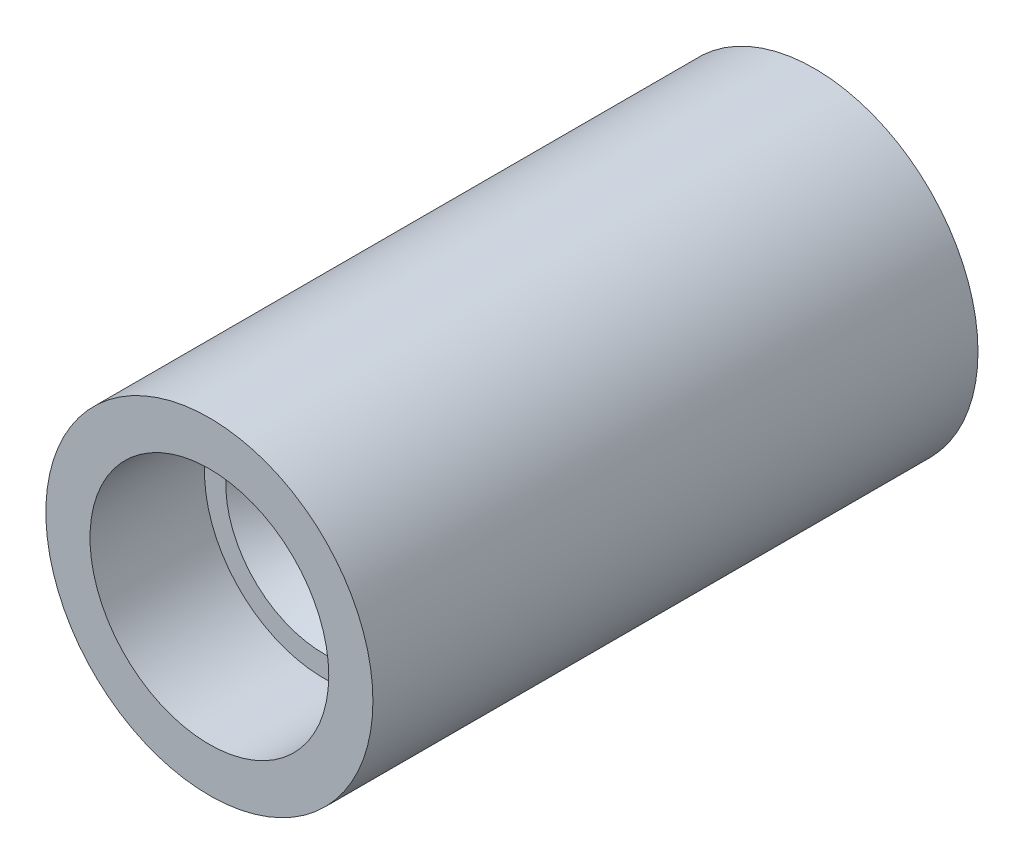
ISO-10303-21;
HEADER;
FILE_DESCRIPTION(('STEP AP214'),'2;1');
FILE_NAME('part.step','',(''),(''),'','','');
FILE_SCHEMA(('AUTOMOTIVE_DESIGN { 1 0 10303 214 1 1 1 1 }'));
ENDSEC;
DATA;
#1=APPLICATION_CONTEXT('core data for automotive mechanical design processes');
#2=APPLICATION_PROTOCOL_DEFINITION('international standard','automotive_design',2000,#1);
#3=PRODUCT_CONTEXT('',#1,'mechanical');
#4=PRODUCT('Part','Part','',(#3));
#5=PRODUCT_RELATED_PRODUCT_CATEGORY('part','',(#4));
#6=PRODUCT_DEFINITION_FORMATION('','',#4);
#7=PRODUCT_DEFINITION_CONTEXT('part definition',#1,'design');
#8=PRODUCT_DEFINITION('design','',#6,#7);
#9=PRODUCT_DEFINITION_SHAPE('','',#8);
#10=(LENGTH_UNIT() NAMED_UNIT(*) SI_UNIT(.MILLI.,.METRE.));
#11=(NAMED_UNIT(*) PLANE_ANGLE_UNIT() SI_UNIT($,.RADIAN.));
#12=(NAMED_UNIT(*) SI_UNIT($,.STERADIAN.) SOLID_ANGLE_UNIT());
#13=UNCERTAINTY_MEASURE_WITH_UNIT(LENGTH_MEASURE(1.E-05),#10,'distance_accuracy_value','');
#14=(GEOMETRIC_REPRESENTATION_CONTEXT(3) GLOBAL_UNCERTAINTY_ASSIGNED_CONTEXT((#13)) GLOBAL_UNIT_ASSIGNED_CONTEXT((#10,
#11,#12)) REPRESENTATION_CONTEXT('',''));
#15=CARTESIAN_POINT('',(0.,0.,0.));
#16=DIRECTION('',(0.,0.,1.));
#17=DIRECTION('',(1.,0.,0.));
#18=AXIS2_PLACEMENT_3D('',#15,#16,#17);
#19=CARTESIAN_POINT('',(0.,0.,28.8237590053236));
#20=DIRECTION('',(0.,0.,-1.));
#21=DIRECTION('',(-1.,0.,0.));
#22=AXIS2_PLACEMENT_3D('',#19,#20,#21);
#23=CYLINDRICAL_SURFACE('',#22,3.65);
#24=CARTESIAN_POINT('',(0.,0.,10.5));
#25=DIRECTION('',(0.,0.,1.));
#26=DIRECTION('',(1.,0.,0.));
#27=AXIS2_PLACEMENT_3D('',#24,#25,#26);
#28=CIRCLE('',#27,3.65);
#29=CARTESIAN_POINT('',(3.65,0.,10.5));
#30=VERTEX_POINT('',#29);
#31=EDGE_CURVE('E140',#30,#30,#28,.F.);
#32=ORIENTED_EDGE('',*,*,#31,.F.);
#33=EDGE_LOOP('',(#32));
#34=FACE_BOUND('',#33,.T.);
#35=CARTESIAN_POINT('',(0.,0.,5.));
#36=DIRECTION('',(0.,0.,1.));
#37=DIRECTION('',(1.,0.,0.));
#38=AXIS2_PLACEMENT_3D('',#35,#36,#37);
#39=CIRCLE('',#38,3.65);
#40=CARTESIAN_POINT('',(1.825,3.1609927238132,5.));
#41=VERTEX_POINT('',#40);
#42=CARTESIAN_POINT('',(3.65,0.,5.));
#43=VERTEX_POINT('',#42);
#44=EDGE_CURVE('E48',#41,#43,#39,.F.);
#45=ORIENTED_EDGE('',*,*,#44,.T.);
#46=CARTESIAN_POINT('',(1.825,-3.1609927238132,5.));
#47=VERTEX_POINT('',#46);
#48=EDGE_CURVE('E13',#43,#47,#39,.F.);
#49=ORIENTED_EDGE('',*,*,#48,.T.);
#50=CARTESIAN_POINT('',(-1.825,-3.1609927238132,5.));
#51=VERTEX_POINT('',#50);
#52=EDGE_CURVE('E174',#47,#51,#39,.F.);
#53=ORIENTED_EDGE('',*,*,#52,.T.);
#54=CARTESIAN_POINT('',(-3.65,0.,5.));
#55=VERTEX_POINT('',#54);
#56=EDGE_CURVE('E172',#51,#55,#39,.F.);
#57=ORIENTED_EDGE('',*,*,#56,.T.);
#58=CARTESIAN_POINT('',(-1.825,3.1609927238132,5.));
#59=VERTEX_POINT('',#58);
#60=EDGE_CURVE('E169',#55,#59,#39,.F.);
#61=ORIENTED_EDGE('',*,*,#60,.T.);
#62=EDGE_CURVE('E43',#59,#41,#39,.F.);
#63=ORIENTED_EDGE('',*,*,#62,.T.);
#64=EDGE_LOOP('',(#45,#49,#53,#57,#61,#63));
#65=FACE_BOUND('',#64,.T.);
#66=ADVANCED_FACE('F38',(#34,#65),#23,.F.);
#67=CARTESIAN_POINT('',(0.,0.,-5.65685424949238));
#68=DIRECTION('',(0.,0.,1.));
#69=DIRECTION('',(1.,0.,0.));
#70=AXIS2_PLACEMENT_3D('',#67,#68,#69);
#71=CYLINDRICAL_SURFACE('',#70,2.);
#72=CARTESIAN_POINT('',(0.,0.,14.));
#73=DIRECTION('',(0.,0.,1.));
#74=DIRECTION('',(1.,0.,0.));
#75=AXIS2_PLACEMENT_3D('',#72,#73,#74);
#76=CIRCLE('',#75,2.);
#77=CARTESIAN_POINT('',(2.,0.,14.));
#78=VERTEX_POINT('',#77);
#79=EDGE_CURVE('E164',#78,#78,#76,.T.);
#80=CARTESIAN_POINT('',(0.,0.,12.));
#81=DIRECTION('',(0.,0.,1.));
#82=DIRECTION('',(1.,0.,0.));
#83=AXIS2_PLACEMENT_3D('',#80,#81,#82);
#84=CIRCLE('',#83,2.);
#85=CARTESIAN_POINT('',(2.,0.,12.));
#86=VERTEX_POINT('',#85);
#87=EDGE_CURVE('E154',#86,#86,#84,.F.);
#88=CARTESIAN_POINT('',(2.,0.,14.));
#89=CARTESIAN_POINT('',(2.,0.,13.9791666666667));
#90=CARTESIAN_POINT('',(2.,0.,13.9583333333333));
#91=CARTESIAN_POINT('',(2.,0.,13.9166666666667));
#92=CARTESIAN_POINT('',(2.,0.,13.8958333333333));
#93=CARTESIAN_POINT('',(2.,0.,13.8541666666667));
#94=CARTESIAN_POINT('',(2.,0.,13.8333333333333));
#95=CARTESIAN_POINT('',(2.,0.,13.7916666666667));
#96=CARTESIAN_POINT('',(2.,0.,13.7708333333333));
#97=CARTESIAN_POINT('',(2.,0.,13.7291666666667));
#98=CARTESIAN_POINT('',(2.,0.,13.7083333333333));
#99=CARTESIAN_POINT('',(2.,0.,13.6666666666667));
#100=CARTESIAN_POINT('',(2.,0.,13.6458333333333));
#101=CARTESIAN_POINT('',(2.,0.,13.6041666666667));
#102=CARTESIAN_POINT('',(2.,0.,13.5833333333333));
#103=CARTESIAN_POINT('',(2.,0.,13.5416666666667));
#104=CARTESIAN_POINT('',(2.,0.,13.5208333333333));
#105=CARTESIAN_POINT('',(2.,0.,13.4791666666667));
#106=CARTESIAN_POINT('',(2.,0.,13.4583333333333));
#107=CARTESIAN_POINT('',(2.,0.,13.4166666666667));
#108=CARTESIAN_POINT('',(2.,0.,13.3958333333333));
#109=CARTESIAN_POINT('',(2.,0.,13.3541666666667));
#110=CARTESIAN_POINT('',(2.,0.,13.3333333333333));
#111=CARTESIAN_POINT('',(2.,0.,13.2916666666667));
#112=CARTESIAN_POINT('',(2.,0.,13.2708333333333));
#113=CARTESIAN_POINT('',(2.,0.,13.2291666666667));
#114=CARTESIAN_POINT('',(2.,0.,13.2083333333333));
#115=CARTESIAN_POINT('',(2.,0.,13.1666666666667));
#116=CARTESIAN_POINT('',(2.,0.,13.1458333333333));
#117=CARTESIAN_POINT('',(2.,0.,13.1041666666667));
#118=CARTESIAN_POINT('',(2.,0.,13.0833333333333));
#119=CARTESIAN_POINT('',(2.,0.,13.0416666666667));
#120=CARTESIAN_POINT('',(2.,0.,13.0208333333333));
#121=CARTESIAN_POINT('',(2.,0.,12.9791666666667));
#122=CARTESIAN_POINT('',(2.,0.,12.9583333333333));
#123=CARTESIAN_POINT('',(2.,0.,12.9166666666667));
#124=CARTESIAN_POINT('',(2.,0.,12.8958333333333));
#125=CARTESIAN_POINT('',(2.,0.,12.8541666666667));
#126=CARTESIAN_POINT('',(2.,0.,12.8333333333333));
#127=CARTESIAN_POINT('',(2.,0.,12.7916666666667));
#128=CARTESIAN_POINT('',(2.,0.,12.7708333333333));
#129=CARTESIAN_POINT('',(2.,0.,12.7291666666667));
#130=CARTESIAN_POINT('',(2.,0.,12.7083333333333));
#131=CARTESIAN_POINT('',(2.,0.,12.6666666666667));
#132=CARTESIAN_POINT('',(2.,0.,12.6458333333333));
#133=CARTESIAN_POINT('',(2.,0.,12.6041666666667));
#134=CARTESIAN_POINT('',(2.,0.,12.5833333333333));
#135=CARTESIAN_POINT('',(2.,0.,12.5416666666667));
#136=CARTESIAN_POINT('',(2.,0.,12.5208333333333));
#137=CARTESIAN_POINT('',(2.,0.,12.4791666666667));
#138=CARTESIAN_POINT('',(2.,0.,12.4583333333333));
#139=CARTESIAN_POINT('',(2.,0.,12.4166666666667));
#140=CARTESIAN_POINT('',(2.,0.,12.3958333333333));
#141=CARTESIAN_POINT('',(2.,0.,12.3541666666667));
#142=CARTESIAN_POINT('',(2.,0.,12.3333333333333));
#143=CARTESIAN_POINT('',(2.,0.,12.2916666666667));
#144=CARTESIAN_POINT('',(2.,0.,12.2708333333333));
#145=CARTESIAN_POINT('',(2.,0.,12.2291666666667));
#146=CARTESIAN_POINT('',(2.,0.,12.2083333333333));
#147=CARTESIAN_POINT('',(2.,0.,12.1666666666667));
#148=CARTESIAN_POINT('',(2.,0.,12.1458333333333));
#149=CARTESIAN_POINT('',(2.,0.,12.1041666666667));
#150=CARTESIAN_POINT('',(2.,0.,12.0833333333333));
#151=CARTESIAN_POINT('',(2.,0.,12.0416666666667));
#152=CARTESIAN_POINT('',(2.,0.,12.0208333333333));
#153=CARTESIAN_POINT('',(2.,0.,12.));
#154=B_SPLINE_CURVE_WITH_KNOTS('',3,(#88,#89,#90,#91,#92,#93,#94,#95,#96,#97,#98,#99,#100,#101,
#102,#103,#104,#105,#106,#107,#108,#109,#110,#111,#112,#113,#114,#115,#116,#117,#118,#119,#120,
#121,#122,#123,#124,#125,#126,#127,#128,#129,#130,#131,#132,#133,#134,#135,#136,#137,#138,#139,
#140,#141,#142,#143,#144,#145,#146,#147,#148,#149,#150,#151,#152,#153),.UNSPECIFIED.,.F.,.F.,(4,
2,2,2,2,2,2,2,2,2,2,2,2,2,2,2,2,2,2,2,2,2,2,2,2,2,2,2,2,2,2,2,4),(0.,0.0625000000000001,0.125,
0.1875,0.25,0.312499999999997,0.374999999999997,0.437499999999997,0.499999999999997,
0.562499999999997,0.624999999999997,0.687499999999997,0.749999999999994,0.812499999999994,
0.874999999999994,0.937499999999994,0.999999999999994,1.06249999999999,1.12499999999999,
1.18749999999999,1.24999999999999,1.31249999999999,1.37499999999999,1.43749999999999,
1.49999999999999,1.56249999999999,1.62499999999999,1.68749999999999,1.74999999999999,
1.81249999999999,1.87499999999999,1.93749999999999,1.99999999999999),.UNSPECIFIED.);
#155=EDGE_CURVE('BSEAM251',#78,#86,#154,.T.);
#156=ORIENTED_EDGE('',*,*,#79,.T.);
#157=ORIENTED_EDGE('',*,*,#87,.T.);
#158=ORIENTED_EDGE('',*,*,#155,.T.);
#159=ORIENTED_EDGE('',*,*,#155,.F.);
#160=EDGE_LOOP('',(#156,#158,#157,#159));
#161=FACE_BOUND('',#160,.T.);
#162=ADVANCED_FACE('F251',(#161),#71,.F.);
#163=CARTESIAN_POINT('',(0.,0.,18.5));
#164=DIRECTION('',(0.,0.,-1.));
#165=DIRECTION('',(-1.,0.,0.));
#166=AXIS2_PLACEMENT_3D('',#163,#164,#165);
#167=CYLINDRICAL_SURFACE('',#166,5.);
#168=CARTESIAN_POINT('',(0.,0.,18.5));
#169=DIRECTION('',(0.,0.,1.));
#170=DIRECTION('',(1.,0.,0.));
#171=AXIS2_PLACEMENT_3D('',#168,#169,#170);
#172=CIRCLE('',#171,5.);
#173=CARTESIAN_POINT('',(5.,0.,18.5));
#174=VERTEX_POINT('',#173);
#175=EDGE_CURVE('E151',#174,#174,#172,.T.);
#176=ORIENTED_EDGE('',*,*,#175,.F.);
#177=EDGE_LOOP('',(#176));
#178=FACE_BOUND('',#177,.T.);
#179=CARTESIAN_POINT('',(0.,0.,0.));
#180=DIRECTION('',(0.,0.,1.));
#181=DIRECTION('',(1.,0.,0.));
#182=AXIS2_PLACEMENT_3D('',#179,#180,#181);
#183=CIRCLE('',#182,5.);
#184=CARTESIAN_POINT('',(5.,0.,0.));
#185=VERTEX_POINT('',#184);
#186=EDGE_CURVE('E148',#185,#185,#183,.T.);
#187=ORIENTED_EDGE('',*,*,#186,.T.);
#188=EDGE_LOOP('',(#187));
#189=FACE_BOUND('',#188,.T.);
#190=ADVANCED_FACE('F256',(#178,#189),#167,.T.);
#191=CARTESIAN_POINT('',(0.,0.,18.5));
#192=DIRECTION('',(0.,0.,1.));
#193=DIRECTION('',(1.,0.,0.));
#194=AXIS2_PLACEMENT_3D('',#191,#192,#193);
#195=PLANE('',#194);
#196=CARTESIAN_POINT('',(0.,0.,18.5));
#197=DIRECTION('',(0.,0.,1.));
#198=DIRECTION('',(1.,0.,0.));
#199=AXIS2_PLACEMENT_3D('',#196,#197,#198);
#200=CIRCLE('',#199,3.65);
#201=CARTESIAN_POINT('',(3.65,0.,18.5));
#202=VERTEX_POINT('',#201);
#203=EDGE_CURVE('E144',#202,#202,#200,.T.);
#204=ORIENTED_EDGE('',*,*,#203,.F.);
#205=EDGE_LOOP('',(#204));
#206=FACE_BOUND('',#205,.T.);
#207=ORIENTED_EDGE('',*,*,#175,.T.);
#208=EDGE_LOOP('',(#207));
#209=FACE_BOUND('',#208,.T.);
#210=ADVANCED_FACE('F273',(#206,#209),#195,.T.);
#211=CARTESIAN_POINT('',(0.,0.,0.));
#212=DIRECTION('',(0.,0.,1.));
#213=DIRECTION('',(1.,0.,0.));
#214=AXIS2_PLACEMENT_3D('',#211,#212,#213);
#215=PLANE('',#214);
#216=DIRECTION('',(-0.866025403784439,0.5,0.));
#217=VECTOR('',#216,1.);
#218=CARTESIAN_POINT('',(0.,-4.21465696508427,0.));
#219=LINE('',#218,#217);
#220=CARTESIAN_POINT('',(0.,-4.21465696508427,0.));
#221=VERTEX_POINT('',#220);
#222=CARTESIAN_POINT('',(-3.65,-2.10732848254213,0.));
#223=VERTEX_POINT('',#222);
#224=EDGE_CURVE('E213',#221,#223,#219,.T.);
#225=ORIENTED_EDGE('',*,*,#224,.F.);
#226=DIRECTION('',(-0.866025403784439,-0.5,0.));
#227=VECTOR('',#226,1.);
#228=CARTESIAN_POINT('',(3.65,-2.10732848254214,0.));
#229=LINE('',#228,#227);
#230=CARTESIAN_POINT('',(3.65,-2.10732848254214,0.));
#231=VERTEX_POINT('',#230);
#232=EDGE_CURVE('E217',#231,#221,#229,.T.);
#233=ORIENTED_EDGE('',*,*,#232,.F.);
#234=DIRECTION('',(0.,-1.,0.));
#235=VECTOR('',#234,1.);
#236=CARTESIAN_POINT('',(3.65,2.10732848254213,0.));
#237=LINE('',#236,#235);
#238=CARTESIAN_POINT('',(3.65,2.10732848254213,0.));
#239=VERTEX_POINT('',#238);
#240=EDGE_CURVE('E220',#239,#231,#237,.T.);
#241=ORIENTED_EDGE('',*,*,#240,.F.);
#242=DIRECTION('',(0.866025403784439,-0.5,0.));
#243=VECTOR('',#242,1.);
#244=CARTESIAN_POINT('',(0.,4.21465696508427,0.));
#245=LINE('',#244,#243);
#246=CARTESIAN_POINT('',(0.,4.21465696508427,0.));
#247=VERTEX_POINT('',#246);
#248=EDGE_CURVE('E133',#247,#239,#245,.T.);
#249=ORIENTED_EDGE('',*,*,#248,.F.);
#250=DIRECTION('',(0.866025403784439,0.5,0.));
#251=VECTOR('',#250,1.);
#252=CARTESIAN_POINT('',(-3.65,2.10732848254214,0.));
#253=LINE('',#252,#251);
#254=CARTESIAN_POINT('',(-3.65,2.10732848254214,0.));
#255=VERTEX_POINT('',#254);
#256=EDGE_CURVE('E225',#255,#247,#253,.T.);
#257=ORIENTED_EDGE('',*,*,#256,.F.);
#258=DIRECTION('',(0.,1.,0.));
#259=VECTOR('',#258,1.);
#260=CARTESIAN_POINT('',(-3.65,-2.10732848254213,0.));
#261=LINE('',#260,#259);
#262=EDGE_CURVE('E55',#223,#255,#261,.T.);
#263=ORIENTED_EDGE('',*,*,#262,.F.);
#264=EDGE_LOOP('',(#225,#233,#241,#249,#257,#263));
#265=FACE_BOUND('',#264,.T.);
#266=ORIENTED_EDGE('',*,*,#186,.F.);
#267=EDGE_LOOP('',(#266));
#268=FACE_BOUND('',#267,.T.);
#269=ADVANCED_FACE('F237',(#265,#268),#215,.F.);
#270=CARTESIAN_POINT('',(0.,0.,15.));
#271=DIRECTION('',(0.,0.,1.));
#272=DIRECTION('',(1.,0.,0.));
#273=AXIS2_PLACEMENT_3D('',#270,#271,#272);
#274=PLANE('',#273);
#275=CARTESIAN_POINT('',(0.,0.,15.));
#276=DIRECTION('',(0.,0.,1.));
#277=DIRECTION('',(1.,0.,0.));
#278=AXIS2_PLACEMENT_3D('',#275,#276,#277);
#279=CIRCLE('',#278,2.99999999999999);
#280=CARTESIAN_POINT('',(2.99999999999999,0.,15.));
#281=VERTEX_POINT('',#280);
#282=EDGE_CURVE('E162',#281,#281,#279,.F.);
#283=ORIENTED_EDGE('',*,*,#282,.T.);
#284=EDGE_LOOP('',(#283));
#285=FACE_BOUND('',#284,.T.);
#286=CARTESIAN_POINT('',(0.,0.,15.));
#287=DIRECTION('',(0.,0.,1.));
#288=DIRECTION('',(1.,0.,0.));
#289=AXIS2_PLACEMENT_3D('',#286,#287,#288);
#290=CIRCLE('',#289,3.65);
#291=CARTESIAN_POINT('',(3.65,0.,15.));
#292=VERTEX_POINT('',#291);
#293=EDGE_CURVE('E145',#292,#292,#290,.T.);
#294=ORIENTED_EDGE('',*,*,#293,.T.);
#295=EDGE_LOOP('',(#294));
#296=FACE_BOUND('',#295,.T.);
#297=ADVANCED_FACE('F266',(#285,#296),#274,.T.);
#298=CARTESIAN_POINT('',(0.,0.,15.));
#299=DIRECTION('',(0.,0.,1.));
#300=DIRECTION('',(1.,0.,0.));
#301=AXIS2_PLACEMENT_3D('',#298,#299,#300);
#302=CYLINDRICAL_SURFACE('',#301,3.65);
#303=ORIENTED_EDGE('',*,*,#293,.F.);
#304=EDGE_LOOP('',(#303));
#305=FACE_BOUND('',#304,.T.);
#306=ORIENTED_EDGE('',*,*,#203,.T.);
#307=EDGE_LOOP('',(#306));
#308=FACE_BOUND('',#307,.T.);
#309=ADVANCED_FACE('F264',(#305,#308),#302,.F.);
#310=CARTESIAN_POINT('',(0.,0.,10.5));
#311=DIRECTION('',(0.,0.,1.));
#312=DIRECTION('',(1.,0.,0.));
#313=AXIS2_PLACEMENT_3D('',#310,#311,#312);
#314=PLANE('',#313);
#315=CARTESIAN_POINT('',(0.,0.,10.5));
#316=DIRECTION('',(0.,0.,1.));
#317=DIRECTION('',(1.,0.,0.));
#318=AXIS2_PLACEMENT_3D('',#315,#316,#317);
#319=CIRCLE('',#318,3.50000000000001);
#320=CARTESIAN_POINT('',(3.50000000000001,0.,10.5));
#321=VERTEX_POINT('',#320);
#322=EDGE_CURVE('E159',#321,#321,#319,.T.);
#323=ORIENTED_EDGE('',*,*,#322,.T.);
#324=EDGE_LOOP('',(#323));
#325=FACE_BOUND('',#324,.T.);
#326=ORIENTED_EDGE('',*,*,#31,.T.);
#327=EDGE_LOOP('',(#326));
#328=FACE_BOUND('',#327,.T.);
#329=ADVANCED_FACE('F260',(#325,#328),#314,.F.);
#330=CARTESIAN_POINT('',(0.,0.,12.));
#331=DIRECTION('',(0.,0.,-1.));
#332=DIRECTION('',(-1.,0.,0.));
#333=AXIS2_PLACEMENT_3D('',#330,#331,#332);
#334=CONICAL_SURFACE('',#333,2.,0.78539816339745);
#335=ORIENTED_EDGE('',*,*,#322,.F.);
#336=EDGE_LOOP('',(#335));
#337=FACE_BOUND('',#336,.T.);
#338=ORIENTED_EDGE('',*,*,#87,.F.);
#339=EDGE_LOOP('',(#338));
#340=FACE_BOUND('',#339,.T.);
#341=ADVANCED_FACE('F263',(#337,#340),#334,.F.);
#342=CARTESIAN_POINT('',(0.,0.,15.));
#343=DIRECTION('',(0.,0.,1.));
#344=DIRECTION('',(1.,0.,0.));
#345=AXIS2_PLACEMENT_3D('',#342,#343,#344);
#346=CONICAL_SURFACE('',#345,2.99999999999999,0.785398163397445);
#347=ORIENTED_EDGE('',*,*,#79,.F.);
#348=EDGE_LOOP('',(#347));
#349=FACE_BOUND('',#348,.T.);
#350=ORIENTED_EDGE('',*,*,#282,.F.);
#351=EDGE_LOOP('',(#350));
#352=FACE_BOUND('',#351,.T.);
#353=ADVANCED_FACE('F41',(#349,#352),#346,.F.);
#354=CARTESIAN_POINT('',(0.,0.,5.));
#355=DIRECTION('',(0.,0.,1.));
#356=DIRECTION('',(1.,0.,0.));
#357=AXIS2_PLACEMENT_3D('',#354,#355,#356);
#358=PLANE('',#357);
#359=DIRECTION('',(0.,-1.,0.));
#360=VECTOR('',#359,1.);
#361=CARTESIAN_POINT('',(3.65,2.10732848254213,5.));
#362=LINE('',#361,#360);
#363=CARTESIAN_POINT('',(3.65,-2.10732848254214,5.));
#364=VERTEX_POINT('',#363);
#365=EDGE_CURVE('E126',#43,#364,#362,.T.);
#366=ORIENTED_EDGE('',*,*,#365,.T.);
#367=DIRECTION('',(-0.866025403784439,-0.5,0.));
#368=VECTOR('',#367,1.);
#369=CARTESIAN_POINT('',(3.65,-2.10732848254214,5.));
#370=LINE('',#369,#368);
#371=EDGE_CURVE('E180',#364,#47,#370,.T.);
#372=ORIENTED_EDGE('',*,*,#371,.T.);
#373=ORIENTED_EDGE('',*,*,#48,.F.);
#374=EDGE_LOOP('',(#366,#372,#373));
#375=FACE_BOUND('',#374,.T.);
#376=ADVANCED_FACE('F178',(#375),#358,.F.);
#377=CARTESIAN_POINT('',(0.,-4.21465696508427,5.));
#378=VERTEX_POINT('',#377);
#379=EDGE_CURVE('E185',#47,#378,#370,.T.);
#380=ORIENTED_EDGE('',*,*,#379,.T.);
#381=DIRECTION('',(-0.866025403784439,0.5,0.));
#382=VECTOR('',#381,1.);
#383=CARTESIAN_POINT('',(0.,-4.21465696508427,5.));
#384=LINE('',#383,#382);
#385=EDGE_CURVE('E190',#378,#51,#384,.T.);
#386=ORIENTED_EDGE('',*,*,#385,.T.);
#387=ORIENTED_EDGE('',*,*,#52,.F.);
#388=EDGE_LOOP('',(#380,#386,#387));
#389=FACE_BOUND('',#388,.T.);
#390=ADVANCED_FACE('F240',(#389),#358,.F.);
#391=CARTESIAN_POINT('',(-3.65,-2.10732848254213,5.));
#392=VERTEX_POINT('',#391);
#393=EDGE_CURVE('E188',#51,#392,#384,.T.);
#394=ORIENTED_EDGE('',*,*,#393,.T.);
#395=DIRECTION('',(0.,1.,0.));
#396=VECTOR('',#395,1.);
#397=CARTESIAN_POINT('',(-3.65,-2.10732848254213,5.));
#398=LINE('',#397,#396);
#399=EDGE_CURVE('E197',#392,#55,#398,.T.);
#400=ORIENTED_EDGE('',*,*,#399,.T.);
#401=ORIENTED_EDGE('',*,*,#56,.F.);
#402=EDGE_LOOP('',(#394,#400,#401));
#403=FACE_BOUND('',#402,.T.);
#404=ADVANCED_FACE('F208',(#403),#358,.F.);
#405=CARTESIAN_POINT('',(-3.65,2.10732848254214,5.));
#406=VERTEX_POINT('',#405);
#407=EDGE_CURVE('E199',#55,#406,#398,.T.);
#408=ORIENTED_EDGE('',*,*,#407,.T.);
#409=DIRECTION('',(0.866025403784439,0.5,0.));
#410=VECTOR('',#409,1.);
#411=CARTESIAN_POINT('',(-3.65,2.10732848254214,5.));
#412=LINE('',#411,#410);
#413=EDGE_CURVE('E141',#406,#59,#412,.T.);
#414=ORIENTED_EDGE('',*,*,#413,.T.);
#415=ORIENTED_EDGE('',*,*,#60,.F.);
#416=EDGE_LOOP('',(#408,#414,#415));
#417=FACE_BOUND('',#416,.T.);
#418=ADVANCED_FACE('F247',(#417),#358,.F.);
#419=CARTESIAN_POINT('',(0.,4.21465696508427,5.));
#420=VERTEX_POINT('',#419);
#421=EDGE_CURVE('E196',#59,#420,#412,.T.);
#422=ORIENTED_EDGE('',*,*,#421,.T.);
#423=DIRECTION('',(0.866025403784439,-0.5,0.));
#424=VECTOR('',#423,1.);
#425=CARTESIAN_POINT('',(0.,4.21465696508427,5.));
#426=LINE('',#425,#424);
#427=EDGE_CURVE('E118',#420,#41,#426,.T.);
#428=ORIENTED_EDGE('',*,*,#427,.T.);
#429=ORIENTED_EDGE('',*,*,#62,.F.);
#430=EDGE_LOOP('',(#422,#428,#429));
#431=FACE_BOUND('',#430,.T.);
#432=ADVANCED_FACE('F233',(#431),#358,.F.);
#433=CARTESIAN_POINT('',(3.65,2.10732848254213,5.));
#434=VERTEX_POINT('',#433);
#435=EDGE_CURVE('E111',#41,#434,#426,.T.);
#436=ORIENTED_EDGE('',*,*,#435,.T.);
#437=EDGE_CURVE('E63',#434,#43,#362,.T.);
#438=ORIENTED_EDGE('',*,*,#437,.T.);
#439=ORIENTED_EDGE('',*,*,#44,.F.);
#440=EDGE_LOOP('',(#436,#438,#439));
#441=FACE_BOUND('',#440,.T.);
#442=ADVANCED_FACE('F112',(#441),#358,.F.);
#443=CARTESIAN_POINT('',(0.,4.21465696508427,21.6509341910592));
#444=DIRECTION('',(0.5,0.866025403784439,0.));
#445=DIRECTION('',(-0.866025403784439,0.5,0.));
#446=AXIS2_PLACEMENT_3D('',#443,#444,#445);
#447=PLANE('',#446);
#448=ORIENTED_EDGE('',*,*,#248,.T.);
#449=DIRECTION('',(0.,0.,-1.));
#450=VECTOR('',#449,1.);
#451=CARTESIAN_POINT('',(3.65,2.10732848254213,21.6509341910592));
#452=LINE('',#451,#450);
#453=EDGE_CURVE('E124',#434,#239,#452,.T.);
#454=ORIENTED_EDGE('',*,*,#453,.F.);
#455=ORIENTED_EDGE('',*,*,#435,.F.);
#456=ORIENTED_EDGE('',*,*,#427,.F.);
#457=DIRECTION('',(0.,0.,-1.));
#458=VECTOR('',#457,1.);
#459=CARTESIAN_POINT('',(0.,4.21465696508427,21.6509341910592));
#460=LINE('',#459,#458);
#461=EDGE_CURVE('E138',#420,#247,#460,.T.);
#462=ORIENTED_EDGE('',*,*,#461,.T.);
#463=EDGE_LOOP('',(#448,#454,#455,#456,#462));
#464=FACE_BOUND('',#463,.T.);
#465=ADVANCED_FACE('F131',(#464),#447,.F.);
#466=CARTESIAN_POINT('',(3.65,2.10732848254213,21.6509341910592));
#467=DIRECTION('',(1.,0.,0.));
#468=DIRECTION('',(0.,1.,0.));
#469=AXIS2_PLACEMENT_3D('',#466,#467,#468);
#470=PLANE('',#469);
#471=ORIENTED_EDGE('',*,*,#240,.T.);
#472=DIRECTION('',(0.,0.,-1.));
#473=VECTOR('',#472,1.);
#474=CARTESIAN_POINT('',(3.65,-2.10732848254214,21.6509341910592));
#475=LINE('',#474,#473);
#476=EDGE_CURVE('E128',#364,#231,#475,.T.);
#477=ORIENTED_EDGE('',*,*,#476,.F.);
#478=ORIENTED_EDGE('',*,*,#365,.F.);
#479=ORIENTED_EDGE('',*,*,#437,.F.);
#480=ORIENTED_EDGE('',*,*,#453,.T.);
#481=EDGE_LOOP('',(#471,#477,#478,#479,#480));
#482=FACE_BOUND('',#481,.T.);
#483=ADVANCED_FACE('F123',(#482),#470,.F.);
#484=CARTESIAN_POINT('',(3.65,-2.10732848254214,21.6509341910592));
#485=DIRECTION('',(0.5,-0.866025403784439,0.));
#486=DIRECTION('',(0.866025403784439,0.5,0.));
#487=AXIS2_PLACEMENT_3D('',#484,#485,#486);
#488=PLANE('',#487);
#489=ORIENTED_EDGE('',*,*,#232,.T.);
#490=DIRECTION('',(0.,0.,-1.));
#491=VECTOR('',#490,1.);
#492=CARTESIAN_POINT('',(0.,-4.21465696508427,21.6509341910592));
#493=LINE('',#492,#491);
#494=EDGE_CURVE('E184',#378,#221,#493,.T.);
#495=ORIENTED_EDGE('',*,*,#494,.F.);
#496=ORIENTED_EDGE('',*,*,#379,.F.);
#497=ORIENTED_EDGE('',*,*,#371,.F.);
#498=ORIENTED_EDGE('',*,*,#476,.T.);
#499=EDGE_LOOP('',(#489,#495,#496,#497,#498));
#500=FACE_BOUND('',#499,.T.);
#501=ADVANCED_FACE('F239',(#500),#488,.F.);
#502=CARTESIAN_POINT('',(0.,-4.21465696508427,21.6509341910592));
#503=DIRECTION('',(-0.5,-0.866025403784439,0.));
#504=DIRECTION('',(0.866025403784439,-0.5,0.));
#505=AXIS2_PLACEMENT_3D('',#502,#503,#504);
#506=PLANE('',#505);
#507=ORIENTED_EDGE('',*,*,#224,.T.);
#508=DIRECTION('',(0.,0.,-1.));
#509=VECTOR('',#508,1.);
#510=CARTESIAN_POINT('',(-3.65,-2.10732848254213,21.6509341910592));
#511=LINE('',#510,#509);
#512=EDGE_CURVE('E198',#392,#223,#511,.T.);
#513=ORIENTED_EDGE('',*,*,#512,.F.);
#514=ORIENTED_EDGE('',*,*,#393,.F.);
#515=ORIENTED_EDGE('',*,*,#385,.F.);
#516=ORIENTED_EDGE('',*,*,#494,.T.);
#517=EDGE_LOOP('',(#507,#513,#514,#515,#516));
#518=FACE_BOUND('',#517,.T.);
#519=ADVANCED_FACE('F212',(#518),#506,.F.);
#520=CARTESIAN_POINT('',(-3.65,-2.10732848254213,21.6509341910592));
#521=DIRECTION('',(-1.,0.,0.));
#522=DIRECTION('',(0.,-1.,0.));
#523=AXIS2_PLACEMENT_3D('',#520,#521,#522);
#524=PLANE('',#523);
#525=ORIENTED_EDGE('',*,*,#262,.T.);
#526=DIRECTION('',(0.,0.,-1.));
#527=VECTOR('',#526,1.);
#528=CARTESIAN_POINT('',(-3.65,2.10732848254214,21.6509341910592));
#529=LINE('',#528,#527);
#530=EDGE_CURVE('E193',#406,#255,#529,.T.);
#531=ORIENTED_EDGE('',*,*,#530,.F.);
#532=ORIENTED_EDGE('',*,*,#407,.F.);
#533=ORIENTED_EDGE('',*,*,#399,.F.);
#534=ORIENTED_EDGE('',*,*,#512,.T.);
#535=EDGE_LOOP('',(#525,#531,#532,#533,#534));
#536=FACE_BOUND('',#535,.T.);
#537=ADVANCED_FACE('F211',(#536),#524,.F.);
#538=CARTESIAN_POINT('',(-3.65,2.10732848254214,21.6509341910592));
#539=DIRECTION('',(-0.5,0.866025403784439,0.));
#540=DIRECTION('',(-0.866025403784439,-0.5,0.));
#541=AXIS2_PLACEMENT_3D('',#538,#539,#540);
#542=PLANE('',#541);
#543=ORIENTED_EDGE('',*,*,#256,.T.);
#544=ORIENTED_EDGE('',*,*,#461,.F.);
#545=ORIENTED_EDGE('',*,*,#421,.F.);
#546=ORIENTED_EDGE('',*,*,#413,.F.);
#547=ORIENTED_EDGE('',*,*,#530,.T.);
#548=EDGE_LOOP('',(#543,#544,#545,#546,#547));
#549=FACE_BOUND('',#548,.T.);
#550=ADVANCED_FACE('F236',(#549),#542,.F.);
#551=CLOSED_SHELL('',(#66,#162,#190,#210,#269,#297,#309,#329,#341,#353,#376,#390,#404,#418,#432,
#442,#465,#483,#501,#519,#537,#550));
#552=MANIFOLD_SOLID_BREP('B2',#551);
#553=ADVANCED_BREP_SHAPE_REPRESENTATION('',(#18,#552),#14);
#554=SHAPE_DEFINITION_REPRESENTATION(#9,#553);
ENDSEC;
END-ISO-10303-21;
